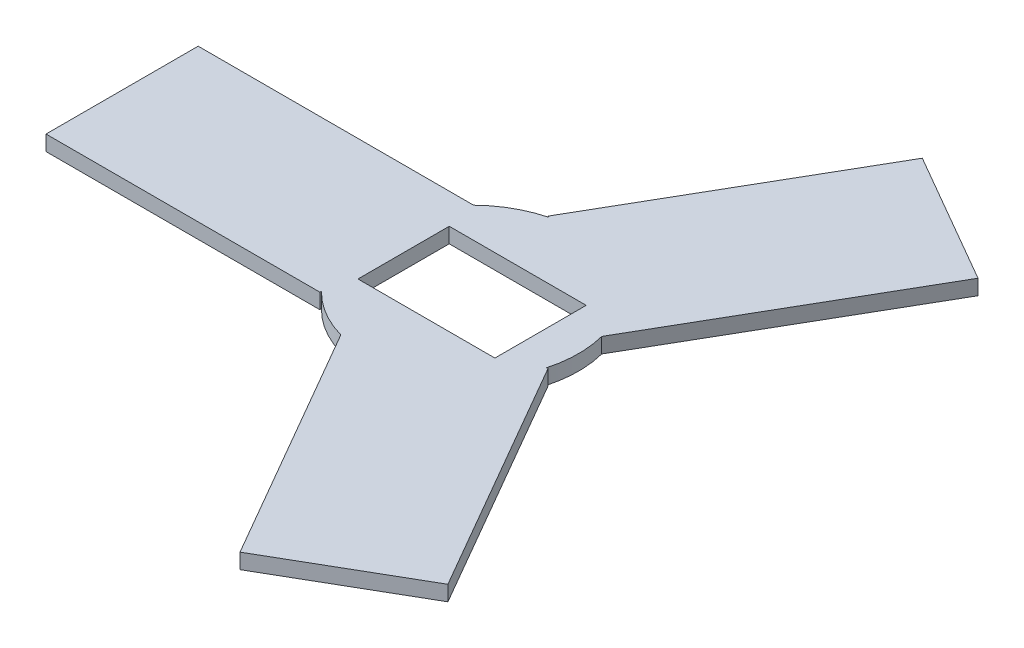
ISO-10303-21;
HEADER;
FILE_DESCRIPTION(('STEP AP214'),'2;1');
FILE_NAME('part.step','',(''),(''),'','','');
FILE_SCHEMA(('AUTOMOTIVE_DESIGN { 1 0 10303 214 1 1 1 1 }'));
ENDSEC;
DATA;
#1=APPLICATION_CONTEXT('core data for automotive mechanical design processes');
#2=APPLICATION_PROTOCOL_DEFINITION('international standard','automotive_design',2000,#1);
#3=PRODUCT_CONTEXT('',#1,'mechanical');
#4=PRODUCT('Part','Part','',(#3));
#5=PRODUCT_RELATED_PRODUCT_CATEGORY('part','',(#4));
#6=PRODUCT_DEFINITION_FORMATION('','',#4);
#7=PRODUCT_DEFINITION_CONTEXT('part definition',#1,'design');
#8=PRODUCT_DEFINITION('design','',#6,#7);
#9=PRODUCT_DEFINITION_SHAPE('','',#8);
#10=(LENGTH_UNIT() NAMED_UNIT(*) SI_UNIT(.MILLI.,.METRE.));
#11=(NAMED_UNIT(*) PLANE_ANGLE_UNIT() SI_UNIT($,.RADIAN.));
#12=(NAMED_UNIT(*) SI_UNIT($,.STERADIAN.) SOLID_ANGLE_UNIT());
#13=UNCERTAINTY_MEASURE_WITH_UNIT(LENGTH_MEASURE(1.E-05),#10,'distance_accuracy_value','');
#14=(GEOMETRIC_REPRESENTATION_CONTEXT(3) GLOBAL_UNCERTAINTY_ASSIGNED_CONTEXT((#13)) GLOBAL_UNIT_ASSIGNED_CONTEXT((#10,
#11,#12)) REPRESENTATION_CONTEXT('',''));
#15=CARTESIAN_POINT('',(0.,0.,0.));
#16=DIRECTION('',(0.,0.,1.));
#17=DIRECTION('',(1.,0.,0.));
#18=AXIS2_PLACEMENT_3D('',#15,#16,#17);
#19=CARTESIAN_POINT('',(0.,5.,-24.9999999999607));
#20=DIRECTION('',(0.,0.,-1.));
#21=DIRECTION('',(-1.,0.,0.));
#22=AXIS2_PLACEMENT_3D('',#19,#20,#21);
#23=PLANE('',#22);
#24=DIRECTION('',(1.,0.,0.));
#25=VECTOR('',#24,1.);
#26=CARTESIAN_POINT('',(0.,0.,-24.9999999999607));
#27=LINE('',#26,#25);
#28=CARTESIAN_POINT('',(-115.,0.,-24.9999999999607));
#29=VERTEX_POINT('',#28);
#30=CARTESIAN_POINT('',(-24.4948974278719,0.,-24.9999999999607));
#31=VERTEX_POINT('',#30);
#32=EDGE_CURVE('E390',#29,#31,#27,.T.);
#33=ORIENTED_EDGE('',*,*,#32,.F.);
#34=DIRECTION('',(0.,-1.,0.));
#35=VECTOR('',#34,1.);
#36=CARTESIAN_POINT('',(-115.,5.,-24.9999999999607));
#37=LINE('',#36,#35);
#38=CARTESIAN_POINT('',(-115.,5.,-24.9999999999607));
#39=VERTEX_POINT('',#38);
#40=EDGE_CURVE('E200',#39,#29,#37,.T.);
#41=ORIENTED_EDGE('',*,*,#40,.F.);
#42=DIRECTION('',(1.,0.,0.));
#43=VECTOR('',#42,1.);
#44=CARTESIAN_POINT('',(0.,5.,-24.9999999999607));
#45=LINE('',#44,#43);
#46=CARTESIAN_POINT('',(-24.4948974278719,5.,-24.9999999999607));
#47=VERTEX_POINT('',#46);
#48=EDGE_CURVE('E372',#39,#47,#45,.T.);
#49=ORIENTED_EDGE('',*,*,#48,.T.);
#50=DIRECTION('',(0.,-1.,0.));
#51=VECTOR('',#50,1.);
#52=CARTESIAN_POINT('',(-24.4948974278719,5.,-24.9999999999607));
#53=LINE('',#52,#51);
#54=EDGE_CURVE('E12',#47,#31,#53,.T.);
#55=ORIENTED_EDGE('',*,*,#54,.T.);
#56=EDGE_LOOP('',(#33,#41,#49,#55));
#57=FACE_BOUND('',#56,.T.);
#58=ADVANCED_FACE('F190',(#57),#23,.T.);
#59=CARTESIAN_POINT('',(-115.,5.,0.));
#60=DIRECTION('',(-1.,0.,0.));
#61=DIRECTION('',(0.,0.,1.));
#62=AXIS2_PLACEMENT_3D('',#59,#60,#61);
#63=PLANE('',#62);
#64=DIRECTION('',(0.,0.,-1.));
#65=VECTOR('',#64,1.);
#66=CARTESIAN_POINT('',(-115.,0.,0.));
#67=LINE('',#66,#65);
#68=CARTESIAN_POINT('',(-115.,0.,25.000000000055));
#69=VERTEX_POINT('',#68);
#70=EDGE_CURVE('E394',#69,#29,#67,.T.);
#71=ORIENTED_EDGE('',*,*,#70,.F.);
#72=DIRECTION('',(0.,-1.,0.));
#73=VECTOR('',#72,1.);
#74=CARTESIAN_POINT('',(-115.,5.,25.000000000055));
#75=LINE('',#74,#73);
#76=CARTESIAN_POINT('',(-115.,5.,25.000000000055));
#77=VERTEX_POINT('',#76);
#78=EDGE_CURVE('E411',#77,#69,#75,.T.);
#79=ORIENTED_EDGE('',*,*,#78,.F.);
#80=DIRECTION('',(0.,0.,-1.));
#81=VECTOR('',#80,1.);
#82=CARTESIAN_POINT('',(-115.,5.,0.));
#83=LINE('',#82,#81);
#84=EDGE_CURVE('E376',#77,#39,#83,.T.);
#85=ORIENTED_EDGE('',*,*,#84,.T.);
#86=ORIENTED_EDGE('',*,*,#40,.T.);
#87=EDGE_LOOP('',(#71,#79,#85,#86));
#88=FACE_BOUND('',#87,.T.);
#89=ADVANCED_FACE('F579',(#88),#63,.T.);
#90=CARTESIAN_POINT('',(0.,5.,25.000000000055));
#91=DIRECTION('',(0.,0.,1.));
#92=DIRECTION('',(1.,0.,0.));
#93=AXIS2_PLACEMENT_3D('',#90,#91,#92);
#94=PLANE('',#93);
#95=DIRECTION('',(-1.,0.,0.));
#96=VECTOR('',#95,1.);
#97=CARTESIAN_POINT('',(0.,0.,25.000000000055));
#98=LINE('',#97,#96);
#99=CARTESIAN_POINT('',(-25.,0.,25.000000000055));
#100=VERTEX_POINT('',#99);
#101=EDGE_CURVE('E399',#100,#69,#98,.T.);
#102=ORIENTED_EDGE('',*,*,#101,.F.);
#103=DIRECTION('',(0.,-1.,0.));
#104=VECTOR('',#103,1.);
#105=CARTESIAN_POINT('',(-25.,5.,25.000000000055));
#106=LINE('',#105,#104);
#107=CARTESIAN_POINT('',(-25.,5.,25.000000000055));
#108=VERTEX_POINT('',#107);
#109=EDGE_CURVE('E408',#108,#100,#106,.T.);
#110=ORIENTED_EDGE('',*,*,#109,.F.);
#111=DIRECTION('',(-1.,0.,0.));
#112=VECTOR('',#111,1.);
#113=CARTESIAN_POINT('',(0.,5.,25.000000000055));
#114=LINE('',#113,#112);
#115=EDGE_CURVE('E381',#108,#77,#114,.T.);
#116=ORIENTED_EDGE('',*,*,#115,.T.);
#117=ORIENTED_EDGE('',*,*,#78,.T.);
#118=EDGE_LOOP('',(#102,#110,#116,#117));
#119=FACE_BOUND('',#118,.T.);
#120=ADVANCED_FACE('F574',(#119),#94,.T.);
#121=CARTESIAN_POINT('',(-24.744923458781,5.,-0.249974489722791));
#122=DIRECTION('',(0.99994897818343,0.,0.0101015360175433));
#123=DIRECTION('',(0.0101015360175433,0.,-0.99994897818343));
#124=AXIS2_PLACEMENT_3D('',#121,#122,#123);
#125=PLANE('',#124);
#126=DIRECTION('',(-0.0101015360175433,0.,0.99994897818343));
#127=VECTOR('',#126,1.);
#128=CARTESIAN_POINT('',(-24.744923458781,0.,-0.249974489722791));
#129=LINE('',#128,#127);
#130=CARTESIAN_POINT('',(-24.9949494896901,0.,24.5000510205151));
#131=VERTEX_POINT('',#130);
#132=EDGE_CURVE('E377',#131,#100,#129,.T.);
#133=ORIENTED_EDGE('',*,*,#132,.F.);
#134=DIRECTION('',(0.,-1.,0.));
#135=VECTOR('',#134,1.);
#136=CARTESIAN_POINT('',(-24.9949494896901,5.,24.5000510205151));
#137=LINE('',#136,#135);
#138=CARTESIAN_POINT('',(-24.9949494896901,5.,24.5000510205151));
#139=VERTEX_POINT('',#138);
#140=EDGE_CURVE('E389',#139,#131,#137,.T.);
#141=ORIENTED_EDGE('',*,*,#140,.F.);
#142=DIRECTION('',(-0.0101015360175433,0.,0.99994897818343));
#143=VECTOR('',#142,1.);
#144=CARTESIAN_POINT('',(-24.744923458781,5.,-0.249974489722791));
#145=LINE('',#144,#143);
#146=EDGE_CURVE('E385',#139,#108,#145,.T.);
#147=ORIENTED_EDGE('',*,*,#146,.T.);
#148=ORIENTED_EDGE('',*,*,#109,.T.);
#149=EDGE_LOOP('',(#133,#141,#147,#148));
#150=FACE_BOUND('',#149,.T.);
#151=ADVANCED_FACE('F571',(#150),#125,.T.);
#152=CARTESIAN_POINT('',(0.,0.,0.));
#153=DIRECTION('',(0.,1.,0.));
#154=DIRECTION('',(0.,0.,1.));
#155=AXIS2_PLACEMENT_3D('',#152,#153,#154);
#156=PLANE('',#155);
#157=DIRECTION('',(-1.,0.,0.));
#158=VECTOR('',#157,1.);
#159=CARTESIAN_POINT('',(22.5,0.,-15.));
#160=LINE('',#159,#158);
#161=CARTESIAN_POINT('',(22.5,0.,-15.));
#162=VERTEX_POINT('',#161);
#163=CARTESIAN_POINT('',(-22.5,0.,-15.));
#164=VERTEX_POINT('',#163);
#165=EDGE_CURVE('E332',#162,#164,#160,.T.);
#166=ORIENTED_EDGE('',*,*,#165,.T.);
#167=DIRECTION('',(0.,0.,1.));
#168=VECTOR('',#167,1.);
#169=CARTESIAN_POINT('',(-22.5,0.,15.));
#170=LINE('',#169,#168);
#171=CARTESIAN_POINT('',(-22.5,0.,15.));
#172=VERTEX_POINT('',#171);
#173=EDGE_CURVE('E325',#164,#172,#170,.T.);
#174=ORIENTED_EDGE('',*,*,#173,.T.);
#175=DIRECTION('',(1.,0.,0.));
#176=VECTOR('',#175,1.);
#177=CARTESIAN_POINT('',(22.5,0.,15.));
#178=LINE('',#177,#176);
#179=CARTESIAN_POINT('',(22.5,0.,15.));
#180=VERTEX_POINT('',#179);
#181=EDGE_CURVE('E335',#172,#180,#178,.T.);
#182=ORIENTED_EDGE('',*,*,#181,.T.);
#183=DIRECTION('',(0.,0.,-1.));
#184=VECTOR('',#183,1.);
#185=CARTESIAN_POINT('',(22.5,0.,15.));
#186=LINE('',#185,#184);
#187=EDGE_CURVE('E208',#180,#162,#186,.T.);
#188=ORIENTED_EDGE('',*,*,#187,.T.);
#189=EDGE_LOOP('',(#166,#174,#182,#188));
#190=FACE_BOUND('',#189,.T.);
#191=ORIENTED_EDGE('',*,*,#32,.T.);
#192=CARTESIAN_POINT('',(0.,0.,0.));
#193=DIRECTION('',(0.,1.,0.));
#194=DIRECTION('',(0.,0.,1.));
#195=AXIS2_PLACEMENT_3D('',#192,#193,#194);
#196=CIRCLE('',#195,35.);
#197=CARTESIAN_POINT('',(-8.72019183293593,0.,-33.896286734638));
#198=VERTEX_POINT('',#197);
#199=EDGE_CURVE('E487',#198,#31,#196,.T.);
#200=ORIENTED_EDGE('',*,*,#199,.F.);
#201=DIRECTION('',(0.86093044958637,0.,0.508722675900151));
#202=VECTOR('',#201,1.);
#203=CARTESIAN_POINT('',(12.5889459877885,0.,-21.3047450851444));
#204=LINE('',#203,#202);
#205=CARTESIAN_POINT('',(-9.15063509465858,0.,-34.1506350946385));
#206=VERTEX_POINT('',#205);
#207=EDGE_CURVE('E499',#206,#198,#204,.T.);
#208=ORIENTED_EDGE('',*,*,#207,.F.);
#209=DIRECTION('',(0.5,0.,-0.866025403784439));
#210=VECTOR('',#209,1.);
#211=CARTESIAN_POINT('',(-21.6506350946586,0.,-12.5000000000275));
#212=LINE('',#211,#210);
#213=CARTESIAN_POINT('',(35.8493649053414,0.,-112.092921435238));
#214=VERTEX_POINT('',#213);
#215=EDGE_CURVE('E495',#206,#214,#212,.T.);
#216=ORIENTED_EDGE('',*,*,#215,.T.);
#217=DIRECTION('',(0.866025403784439,0.,0.5));
#218=VECTOR('',#217,1.);
#219=CARTESIAN_POINT('',(57.5,0.,-99.5929214352105));
#220=LINE('',#219,#218);
#221=CARTESIAN_POINT('',(79.1506350945769,0.,-87.0929214352301));
#222=VERTEX_POINT('',#221);
#223=EDGE_CURVE('E491',#214,#222,#220,.T.);
#224=ORIENTED_EDGE('',*,*,#223,.T.);
#225=DIRECTION('',(0.5,0.,-0.866025403784439));
#226=VECTOR('',#225,1.);
#227=CARTESIAN_POINT('',(21.6506350945769,0.,12.4999999999803));
#228=LINE('',#227,#226);
#229=CARTESIAN_POINT('',(33.8980838085129,0.,-8.71320343565085));
#230=VERTEX_POINT('',#229);
#231=EDGE_CURVE('E486',#230,#222,#228,.T.);
#232=ORIENTED_EDGE('',*,*,#231,.F.);
#233=CARTESIAN_POINT('',(33.715141322626,0.,9.39623571412291));
#234=VERTEX_POINT('',#233);
#235=EDGE_CURVE('E366',#234,#230,#196,.T.);
#236=ORIENTED_EDGE('',*,*,#235,.F.);
#237=DIRECTION('',(0.871031985603914,0.,-0.49122630228328));
#238=VECTOR('',#237,1.);
#239=CARTESIAN_POINT('',(12.1559774709925,0.,21.5547195748672));
#240=LINE('',#239,#238);
#241=CARTESIAN_POINT('',(34.1506350946586,0.,9.15063509458348));
#242=VERTEX_POINT('',#241);
#243=EDGE_CURVE('E420',#234,#242,#240,.T.);
#244=ORIENTED_EDGE('',*,*,#243,.T.);
#245=DIRECTION('',(0.500000000000001,0.,0.866025403784438));
#246=VECTOR('',#245,1.);
#247=CARTESIAN_POINT('',(21.6506350946586,0.,-12.5000000000275));
#248=LINE('',#247,#246);
#249=CARTESIAN_POINT('',(79.1506350946587,0.,87.0929214351829));
#250=VERTEX_POINT('',#249);
#251=EDGE_CURVE('E441',#242,#250,#248,.T.);
#252=ORIENTED_EDGE('',*,*,#251,.T.);
#253=DIRECTION('',(-0.866025403784438,0.,0.5));
#254=VECTOR('',#253,1.);
#255=CARTESIAN_POINT('',(57.5000000000001,0.,99.5929214352104));
#256=LINE('',#255,#254);
#257=CARTESIAN_POINT('',(35.8493649054231,0.,112.092921435191));
#258=VERTEX_POINT('',#257);
#259=EDGE_CURVE('E437',#250,#258,#256,.T.);
#260=ORIENTED_EDGE('',*,*,#259,.T.);
#261=DIRECTION('',(0.5,0.,0.866025403784438));
#262=VECTOR('',#261,1.);
#263=CARTESIAN_POINT('',(-21.6506350945769,0.,12.4999999999803));
#264=LINE('',#263,#262);
#265=CARTESIAN_POINT('',(-9.40318638064095,0.,33.7132034356115));
#266=VERTEX_POINT('',#265);
#267=EDGE_CURVE('E433',#266,#258,#264,.T.);
#268=ORIENTED_EDGE('',*,*,#267,.F.);
#269=EDGE_CURVE('E466',#131,#266,#196,.T.);
#270=ORIENTED_EDGE('',*,*,#269,.F.);
#271=ORIENTED_EDGE('',*,*,#132,.T.);
#272=ORIENTED_EDGE('',*,*,#101,.T.);
#273=ORIENTED_EDGE('',*,*,#70,.T.);
#274=EDGE_LOOP('',(#191,#200,#208,#216,#224,#232,#236,#244,#252,#260,#268,#270,#271,#272,#273));
#275=FACE_BOUND('',#274,.T.);
#276=ADVANCED_FACE('F340',(#190,#275),#156,.F.);
#277=CARTESIAN_POINT('',(0.,5.,0.));
#278=DIRECTION('',(0.,1.,0.));
#279=DIRECTION('',(0.,0.,1.));
#280=AXIS2_PLACEMENT_3D('',#277,#278,#279);
#281=PLANE('',#280);
#282=DIRECTION('',(0.,0.,1.));
#283=VECTOR('',#282,1.);
#284=CARTESIAN_POINT('',(-22.5,5.,15.));
#285=LINE('',#284,#283);
#286=CARTESIAN_POINT('',(-22.5,5.,-15.));
#287=VERTEX_POINT('',#286);
#288=CARTESIAN_POINT('',(-22.5,5.,15.));
#289=VERTEX_POINT('',#288);
#290=EDGE_CURVE('E216',#287,#289,#285,.T.);
#291=ORIENTED_EDGE('',*,*,#290,.F.);
#292=DIRECTION('',(-1.,0.,0.));
#293=VECTOR('',#292,1.);
#294=CARTESIAN_POINT('',(22.5,5.,-15.));
#295=LINE('',#294,#293);
#296=CARTESIAN_POINT('',(22.5,5.,-15.));
#297=VERTEX_POINT('',#296);
#298=EDGE_CURVE('E344',#297,#287,#295,.T.);
#299=ORIENTED_EDGE('',*,*,#298,.F.);
#300=DIRECTION('',(0.,0.,-1.));
#301=VECTOR('',#300,1.);
#302=CARTESIAN_POINT('',(22.5,5.,15.));
#303=LINE('',#302,#301);
#304=CARTESIAN_POINT('',(22.5,5.,15.));
#305=VERTEX_POINT('',#304);
#306=EDGE_CURVE('E348',#305,#297,#303,.T.);
#307=ORIENTED_EDGE('',*,*,#306,.F.);
#308=DIRECTION('',(1.,0.,0.));
#309=VECTOR('',#308,1.);
#310=CARTESIAN_POINT('',(22.5,5.,15.));
#311=LINE('',#310,#309);
#312=EDGE_CURVE('E357',#289,#305,#311,.T.);
#313=ORIENTED_EDGE('',*,*,#312,.F.);
#314=EDGE_LOOP('',(#291,#299,#307,#313));
#315=FACE_BOUND('',#314,.T.);
#316=ORIENTED_EDGE('',*,*,#146,.F.);
#317=CARTESIAN_POINT('',(0.,5.,0.));
#318=DIRECTION('',(0.,1.,0.));
#319=DIRECTION('',(0.,0.,1.));
#320=AXIS2_PLACEMENT_3D('',#317,#318,#319);
#321=CIRCLE('',#320,35.);
#322=CARTESIAN_POINT('',(-9.40318638064095,5.,33.7132034356115));
#323=VERTEX_POINT('',#322);
#324=EDGE_CURVE('E467',#139,#323,#321,.T.);
#325=ORIENTED_EDGE('',*,*,#324,.T.);
#326=DIRECTION('',(0.5,0.,0.866025403784438));
#327=VECTOR('',#326,1.);
#328=CARTESIAN_POINT('',(-21.6506350945769,5.,12.4999999999803));
#329=LINE('',#328,#327);
#330=CARTESIAN_POINT('',(35.8493649054231,5.,112.092921435191));
#331=VERTEX_POINT('',#330);
#332=EDGE_CURVE('E416',#323,#331,#329,.T.);
#333=ORIENTED_EDGE('',*,*,#332,.T.);
#334=DIRECTION('',(-0.866025403784438,0.,0.5));
#335=VECTOR('',#334,1.);
#336=CARTESIAN_POINT('',(57.5000000000001,5.,99.5929214352104));
#337=LINE('',#336,#335);
#338=CARTESIAN_POINT('',(79.1506350946587,5.,87.0929214351829));
#339=VERTEX_POINT('',#338);
#340=EDGE_CURVE('E419',#339,#331,#337,.T.);
#341=ORIENTED_EDGE('',*,*,#340,.F.);
#342=DIRECTION('',(0.500000000000001,0.,0.866025403784438));
#343=VECTOR('',#342,1.);
#344=CARTESIAN_POINT('',(21.6506350946586,5.,-12.5000000000275));
#345=LINE('',#344,#343);
#346=CARTESIAN_POINT('',(34.1506350946586,5.,9.15063509458348));
#347=VERTEX_POINT('',#346);
#348=EDGE_CURVE('E424',#347,#339,#345,.T.);
#349=ORIENTED_EDGE('',*,*,#348,.F.);
#350=DIRECTION('',(0.871031985603914,0.,-0.49122630228328));
#351=VECTOR('',#350,1.);
#352=CARTESIAN_POINT('',(12.1559774709925,5.,21.5547195748672));
#353=LINE('',#352,#351);
#354=CARTESIAN_POINT('',(33.715141322626,5.,9.39623571412291));
#355=VERTEX_POINT('',#354);
#356=EDGE_CURVE('E428',#355,#347,#353,.T.);
#357=ORIENTED_EDGE('',*,*,#356,.F.);
#358=CARTESIAN_POINT('',(33.8980838085129,5.,-8.71320343565085));
#359=VERTEX_POINT('',#358);
#360=EDGE_CURVE('E461',#355,#359,#321,.T.);
#361=ORIENTED_EDGE('',*,*,#360,.T.);
#362=DIRECTION('',(0.5,0.,-0.866025403784439));
#363=VECTOR('',#362,1.);
#364=CARTESIAN_POINT('',(21.6506350945769,5.,12.4999999999803));
#365=LINE('',#364,#363);
#366=CARTESIAN_POINT('',(79.1506350945769,5.,-87.0929214352301));
#367=VERTEX_POINT('',#366);
#368=EDGE_CURVE('E465',#359,#367,#365,.T.);
#369=ORIENTED_EDGE('',*,*,#368,.T.);
#370=DIRECTION('',(0.866025403784439,0.,0.5));
#371=VECTOR('',#370,1.);
#372=CARTESIAN_POINT('',(57.5,5.,-99.5929214352105));
#373=LINE('',#372,#371);
#374=CARTESIAN_POINT('',(35.8493649053414,5.,-112.092921435238));
#375=VERTEX_POINT('',#374);
#376=EDGE_CURVE('E471',#375,#367,#373,.T.);
#377=ORIENTED_EDGE('',*,*,#376,.F.);
#378=DIRECTION('',(0.5,0.,-0.866025403784439));
#379=VECTOR('',#378,1.);
#380=CARTESIAN_POINT('',(-21.6506350946586,5.,-12.5000000000275));
#381=LINE('',#380,#379);
#382=CARTESIAN_POINT('',(-9.15063509465858,5.,-34.1506350946385));
#383=VERTEX_POINT('',#382);
#384=EDGE_CURVE('E475',#383,#375,#381,.T.);
#385=ORIENTED_EDGE('',*,*,#384,.F.);
#386=DIRECTION('',(0.86093044958637,0.,0.508722675900151));
#387=VECTOR('',#386,1.);
#388=CARTESIAN_POINT('',(12.5889459877885,5.,-21.3047450851444));
#389=LINE('',#388,#387);
#390=CARTESIAN_POINT('',(-8.72019183293593,5.,-33.896286734638));
#391=VERTEX_POINT('',#390);
#392=EDGE_CURVE('E479',#383,#391,#389,.T.);
#393=ORIENTED_EDGE('',*,*,#392,.T.);
#394=EDGE_CURVE('E468',#391,#47,#321,.T.);
#395=ORIENTED_EDGE('',*,*,#394,.T.);
#396=ORIENTED_EDGE('',*,*,#48,.F.);
#397=ORIENTED_EDGE('',*,*,#84,.F.);
#398=ORIENTED_EDGE('',*,*,#115,.F.);
#399=EDGE_LOOP('',(#316,#325,#333,#341,#349,#357,#361,#369,#377,#385,#393,#395,#396,#397,#398));
#400=FACE_BOUND('',#399,.T.);
#401=ADVANCED_FACE('F533',(#315,#400),#281,.T.);
#402=CARTESIAN_POINT('',(21.6506350946586,5.,-12.5000000000275));
#403=DIRECTION('',(0.866025403784438,0.,-0.500000000000001));
#404=DIRECTION('',(-0.500000000000001,0.,-0.866025403784438));
#405=AXIS2_PLACEMENT_3D('',#402,#403,#404);
#406=PLANE('',#405);
#407=ORIENTED_EDGE('',*,*,#251,.F.);
#408=DIRECTION('',(0.,-1.,0.));
#409=VECTOR('',#408,1.);
#410=CARTESIAN_POINT('',(34.1506350946586,5.,9.15063509458348));
#411=LINE('',#410,#409);
#412=EDGE_CURVE('E450',#347,#242,#411,.T.);
#413=ORIENTED_EDGE('',*,*,#412,.F.);
#414=ORIENTED_EDGE('',*,*,#348,.T.);
#415=DIRECTION('',(0.,-1.,0.));
#416=VECTOR('',#415,1.);
#417=CARTESIAN_POINT('',(79.1506350946587,5.,87.0929214351829));
#418=LINE('',#417,#416);
#419=EDGE_CURVE('E453',#339,#250,#418,.T.);
#420=ORIENTED_EDGE('',*,*,#419,.T.);
#421=EDGE_LOOP('',(#407,#413,#414,#420));
#422=FACE_BOUND('',#421,.T.);
#423=ADVANCED_FACE('F564',(#422),#406,.T.);
#424=CARTESIAN_POINT('',(12.1559774709925,5.,21.5547195748672));
#425=DIRECTION('',(-0.49122630228328,0.,-0.871031985603913));
#426=DIRECTION('',(-0.871031985603913,0.,0.49122630228328));
#427=AXIS2_PLACEMENT_3D('',#424,#425,#426);
#428=PLANE('',#427);
#429=ORIENTED_EDGE('',*,*,#243,.F.);
#430=DIRECTION('',(0.,-1.,0.));
#431=VECTOR('',#430,1.);
#432=CARTESIAN_POINT('',(33.715141322626,5.,9.39623571412291));
#433=LINE('',#432,#431);
#434=EDGE_CURVE('E432',#355,#234,#433,.T.);
#435=ORIENTED_EDGE('',*,*,#434,.F.);
#436=ORIENTED_EDGE('',*,*,#356,.T.);
#437=ORIENTED_EDGE('',*,*,#412,.T.);
#438=EDGE_LOOP('',(#429,#435,#436,#437));
#439=FACE_BOUND('',#438,.T.);
#440=ADVANCED_FACE('F566',(#439),#428,.T.);
#441=CARTESIAN_POINT('',(21.6506350945769,5.,12.4999999999803));
#442=DIRECTION('',(-0.866025403784439,0.,-0.5));
#443=DIRECTION('',(-0.5,0.,0.866025403784439));
#444=AXIS2_PLACEMENT_3D('',#441,#442,#443);
#445=PLANE('',#444);
#446=ORIENTED_EDGE('',*,*,#231,.T.);
#447=DIRECTION('',(0.,-1.,0.));
#448=VECTOR('',#447,1.);
#449=CARTESIAN_POINT('',(79.1506350945769,5.,-87.0929214352301));
#450=LINE('',#449,#448);
#451=EDGE_CURVE('E511',#367,#222,#450,.T.);
#452=ORIENTED_EDGE('',*,*,#451,.F.);
#453=ORIENTED_EDGE('',*,*,#368,.F.);
#454=DIRECTION('',(0.,-1.,0.));
#455=VECTOR('',#454,1.);
#456=CARTESIAN_POINT('',(33.8980838085129,5.,-8.71320343565085));
#457=LINE('',#456,#455);
#458=EDGE_CURVE('E194',#359,#230,#457,.T.);
#459=ORIENTED_EDGE('',*,*,#458,.T.);
#460=EDGE_LOOP('',(#446,#452,#453,#459));
#461=FACE_BOUND('',#460,.T.);
#462=ADVANCED_FACE('F192',(#461),#445,.F.);
#463=CARTESIAN_POINT('',(57.5,5.,-99.5929214352105));
#464=DIRECTION('',(0.5,0.,-0.866025403784439));
#465=DIRECTION('',(-0.866025403784439,0.,-0.5));
#466=AXIS2_PLACEMENT_3D('',#463,#464,#465);
#467=PLANE('',#466);
#468=ORIENTED_EDGE('',*,*,#223,.F.);
#469=DIRECTION('',(0.,-1.,0.));
#470=VECTOR('',#469,1.);
#471=CARTESIAN_POINT('',(35.8493649053414,5.,-112.092921435238));
#472=LINE('',#471,#470);
#473=EDGE_CURVE('E509',#375,#214,#472,.T.);
#474=ORIENTED_EDGE('',*,*,#473,.F.);
#475=ORIENTED_EDGE('',*,*,#376,.T.);
#476=ORIENTED_EDGE('',*,*,#451,.T.);
#477=EDGE_LOOP('',(#468,#474,#475,#476));
#478=FACE_BOUND('',#477,.T.);
#479=ADVANCED_FACE('F527',(#478),#467,.T.);
#480=CARTESIAN_POINT('',(-21.6506350946586,5.,-12.5000000000275));
#481=DIRECTION('',(-0.866025403784439,0.,-0.5));
#482=DIRECTION('',(-0.5,0.,0.866025403784439));
#483=AXIS2_PLACEMENT_3D('',#480,#481,#482);
#484=PLANE('',#483);
#485=ORIENTED_EDGE('',*,*,#215,.F.);
#486=DIRECTION('',(0.,-1.,0.));
#487=VECTOR('',#486,1.);
#488=CARTESIAN_POINT('',(-9.15063509465858,5.,-34.1506350946385));
#489=LINE('',#488,#487);
#490=EDGE_CURVE('E506',#383,#206,#489,.T.);
#491=ORIENTED_EDGE('',*,*,#490,.F.);
#492=ORIENTED_EDGE('',*,*,#384,.T.);
#493=ORIENTED_EDGE('',*,*,#473,.T.);
#494=EDGE_LOOP('',(#485,#491,#492,#493));
#495=FACE_BOUND('',#494,.T.);
#496=ADVANCED_FACE('F534',(#495),#484,.T.);
#497=CARTESIAN_POINT('',(57.5000000000001,5.,99.5929214352104));
#498=DIRECTION('',(0.5,0.,0.866025403784438));
#499=DIRECTION('',(0.866025403784438,0.,-0.5));
#500=AXIS2_PLACEMENT_3D('',#497,#498,#499);
#501=PLANE('',#500);
#502=ORIENTED_EDGE('',*,*,#259,.F.);
#503=ORIENTED_EDGE('',*,*,#419,.F.);
#504=ORIENTED_EDGE('',*,*,#340,.T.);
#505=DIRECTION('',(0.,-1.,0.));
#506=VECTOR('',#505,1.);
#507=CARTESIAN_POINT('',(35.8493649054231,5.,112.092921435191));
#508=LINE('',#507,#506);
#509=EDGE_CURVE('E456',#331,#258,#508,.T.);
#510=ORIENTED_EDGE('',*,*,#509,.T.);
#511=EDGE_LOOP('',(#502,#503,#504,#510));
#512=FACE_BOUND('',#511,.T.);
#513=ADVANCED_FACE('F559',(#512),#501,.T.);
#514=CARTESIAN_POINT('',(0.,5.,0.));
#515=DIRECTION('',(0.,-1.,0.));
#516=DIRECTION('',(0.,0.,-1.));
#517=AXIS2_PLACEMENT_3D('',#514,#515,#516);
#518=CYLINDRICAL_SURFACE('',#517,35.);
#519=ORIENTED_EDGE('',*,*,#235,.T.);
#520=ORIENTED_EDGE('',*,*,#458,.F.);
#521=ORIENTED_EDGE('',*,*,#360,.F.);
#522=ORIENTED_EDGE('',*,*,#434,.T.);
#523=EDGE_LOOP('',(#519,#520,#521,#522));
#524=FACE_BOUND('',#523,.T.);
#525=ADVANCED_FACE('F523',(#524),#518,.T.);
#526=CARTESIAN_POINT('',(12.5889459877885,5.,-21.3047450851444));
#527=DIRECTION('',(0.508722675900151,0.,-0.86093044958637));
#528=DIRECTION('',(-0.86093044958637,0.,-0.508722675900151));
#529=AXIS2_PLACEMENT_3D('',#526,#527,#528);
#530=PLANE('',#529);
#531=ORIENTED_EDGE('',*,*,#207,.T.);
#532=DIRECTION('',(0.,-1.,0.));
#533=VECTOR('',#532,1.);
#534=CARTESIAN_POINT('',(-8.72019183293593,5.,-33.896286734638));
#535=LINE('',#534,#533);
#536=EDGE_CURVE('E503',#391,#198,#535,.T.);
#537=ORIENTED_EDGE('',*,*,#536,.F.);
#538=ORIENTED_EDGE('',*,*,#392,.F.);
#539=ORIENTED_EDGE('',*,*,#490,.T.);
#540=EDGE_LOOP('',(#531,#537,#538,#539));
#541=FACE_BOUND('',#540,.T.);
#542=ADVANCED_FACE('F537',(#541),#530,.F.);
#543=CARTESIAN_POINT('',(-21.6506350945769,5.,12.4999999999803));
#544=DIRECTION('',(0.866025403784438,0.,-0.5));
#545=DIRECTION('',(-0.5,0.,-0.866025403784438));
#546=AXIS2_PLACEMENT_3D('',#543,#544,#545);
#547=PLANE('',#546);
#548=ORIENTED_EDGE('',*,*,#267,.T.);
#549=ORIENTED_EDGE('',*,*,#509,.F.);
#550=ORIENTED_EDGE('',*,*,#332,.F.);
#551=DIRECTION('',(0.,-1.,0.));
#552=VECTOR('',#551,1.);
#553=CARTESIAN_POINT('',(-9.40318638064095,5.,33.7132034356115));
#554=LINE('',#553,#552);
#555=EDGE_CURVE('E395',#323,#266,#554,.T.);
#556=ORIENTED_EDGE('',*,*,#555,.T.);
#557=EDGE_LOOP('',(#548,#549,#550,#556));
#558=FACE_BOUND('',#557,.T.);
#559=ADVANCED_FACE('F554',(#558),#547,.F.);
#560=ORIENTED_EDGE('',*,*,#269,.T.);
#561=ORIENTED_EDGE('',*,*,#555,.F.);
#562=ORIENTED_EDGE('',*,*,#324,.F.);
#563=ORIENTED_EDGE('',*,*,#140,.T.);
#564=EDGE_LOOP('',(#560,#561,#562,#563));
#565=FACE_BOUND('',#564,.T.);
#566=ADVANCED_FACE('F604',(#565),#518,.T.);
#567=ORIENTED_EDGE('',*,*,#199,.T.);
#568=ORIENTED_EDGE('',*,*,#54,.F.);
#569=ORIENTED_EDGE('',*,*,#394,.F.);
#570=ORIENTED_EDGE('',*,*,#536,.T.);
#571=EDGE_LOOP('',(#567,#568,#569,#570));
#572=FACE_BOUND('',#571,.T.);
#573=ADVANCED_FACE('F543',(#572),#518,.T.);
#574=CARTESIAN_POINT('',(-22.5,0.,15.));
#575=DIRECTION('',(-1.,0.,0.));
#576=DIRECTION('',(0.,0.,1.));
#577=AXIS2_PLACEMENT_3D('',#574,#575,#576);
#578=PLANE('',#577);
#579=ORIENTED_EDGE('',*,*,#290,.T.);
#580=DIRECTION('',(0.,1.,0.));
#581=VECTOR('',#580,1.);
#582=CARTESIAN_POINT('',(-22.5,0.,15.));
#583=LINE('',#582,#581);
#584=EDGE_CURVE('E321',#172,#289,#583,.T.);
#585=ORIENTED_EDGE('',*,*,#584,.F.);
#586=ORIENTED_EDGE('',*,*,#173,.F.);
#587=DIRECTION('',(0.,1.,0.));
#588=VECTOR('',#587,1.);
#589=CARTESIAN_POINT('',(-22.5,0.,-15.));
#590=LINE('',#589,#588);
#591=EDGE_CURVE('E363',#164,#287,#590,.T.);
#592=ORIENTED_EDGE('',*,*,#591,.T.);
#593=EDGE_LOOP('',(#579,#585,#586,#592));
#594=FACE_BOUND('',#593,.T.);
#595=ADVANCED_FACE('F323',(#594),#578,.F.);
#596=CARTESIAN_POINT('',(22.5,0.,-15.));
#597=DIRECTION('',(0.,0.,-1.));
#598=DIRECTION('',(-1.,0.,0.));
#599=AXIS2_PLACEMENT_3D('',#596,#597,#598);
#600=PLANE('',#599);
#601=ORIENTED_EDGE('',*,*,#298,.T.);
#602=ORIENTED_EDGE('',*,*,#591,.F.);
#603=ORIENTED_EDGE('',*,*,#165,.F.);
#604=DIRECTION('',(0.,1.,0.));
#605=VECTOR('',#604,1.);
#606=CARTESIAN_POINT('',(22.5,0.,-15.));
#607=LINE('',#606,#605);
#608=EDGE_CURVE('E367',#162,#297,#607,.T.);
#609=ORIENTED_EDGE('',*,*,#608,.T.);
#610=EDGE_LOOP('',(#601,#602,#603,#609));
#611=FACE_BOUND('',#610,.T.);
#612=ADVANCED_FACE('F623',(#611),#600,.F.);
#613=CARTESIAN_POINT('',(22.5,0.,15.));
#614=DIRECTION('',(1.,0.,0.));
#615=DIRECTION('',(0.,0.,-1.));
#616=AXIS2_PLACEMENT_3D('',#613,#614,#615);
#617=PLANE('',#616);
#618=ORIENTED_EDGE('',*,*,#306,.T.);
#619=ORIENTED_EDGE('',*,*,#608,.F.);
#620=ORIENTED_EDGE('',*,*,#187,.F.);
#621=DIRECTION('',(0.,1.,0.));
#622=VECTOR('',#621,1.);
#623=CARTESIAN_POINT('',(22.5,0.,15.));
#624=LINE('',#623,#622);
#625=EDGE_CURVE('E331',#180,#305,#624,.T.);
#626=ORIENTED_EDGE('',*,*,#625,.T.);
#627=EDGE_LOOP('',(#618,#619,#620,#626));
#628=FACE_BOUND('',#627,.T.);
#629=ADVANCED_FACE('F628',(#628),#617,.F.);
#630=CARTESIAN_POINT('',(22.5,0.,15.));
#631=DIRECTION('',(0.,0.,1.));
#632=DIRECTION('',(1.,0.,0.));
#633=AXIS2_PLACEMENT_3D('',#630,#631,#632);
#634=PLANE('',#633);
#635=ORIENTED_EDGE('',*,*,#312,.T.);
#636=ORIENTED_EDGE('',*,*,#625,.F.);
#637=ORIENTED_EDGE('',*,*,#181,.F.);
#638=ORIENTED_EDGE('',*,*,#584,.T.);
#639=EDGE_LOOP('',(#635,#636,#637,#638));
#640=FACE_BOUND('',#639,.T.);
#641=ADVANCED_FACE('F336',(#640),#634,.F.);
#642=CLOSED_SHELL('',(#58,#89,#120,#151,#276,#401,#423,#440,#462,#479,#496,#513,#525,#542,#559,
#566,#573,#595,#612,#629,#641));
#643=MANIFOLD_SOLID_BREP('B2',#642);
#644=ADVANCED_BREP_SHAPE_REPRESENTATION('',(#18,#643),#14);
#645=SHAPE_DEFINITION_REPRESENTATION(#9,#644);
ENDSEC;
END-ISO-10303-21;
